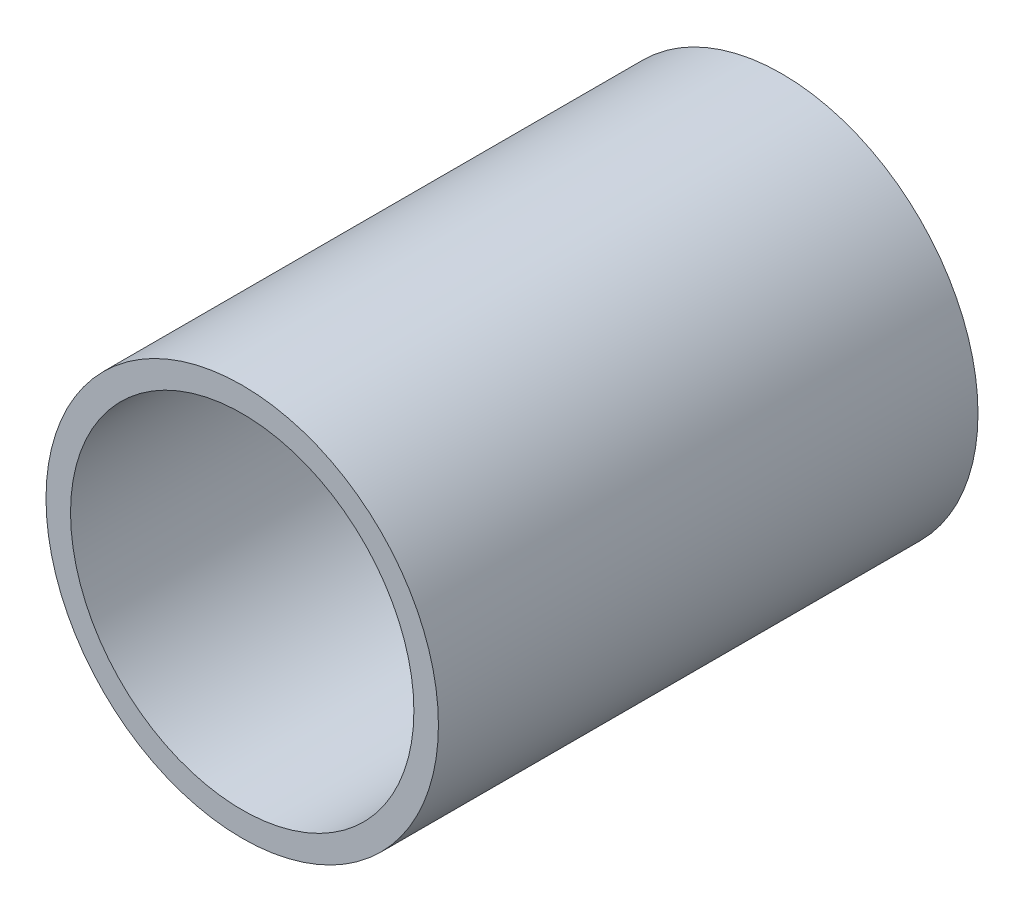
ISO-10303-21;
HEADER;
FILE_DESCRIPTION(('STEP AP214'),'2;1');
FILE_NAME('part.step','',(''),(''),'','','');
FILE_SCHEMA(('AUTOMOTIVE_DESIGN { 1 0 10303 214 1 1 1 1 }'));
ENDSEC;
DATA;
#1=APPLICATION_CONTEXT('core data for automotive mechanical design processes');
#2=APPLICATION_PROTOCOL_DEFINITION('international standard','automotive_design',2000,#1);
#3=PRODUCT_CONTEXT('',#1,'mechanical');
#4=PRODUCT('Part','Part','',(#3));
#5=PRODUCT_RELATED_PRODUCT_CATEGORY('part','',(#4));
#6=PRODUCT_DEFINITION_FORMATION('','',#4);
#7=PRODUCT_DEFINITION_CONTEXT('part definition',#1,'design');
#8=PRODUCT_DEFINITION('design','',#6,#7);
#9=PRODUCT_DEFINITION_SHAPE('','',#8);
#10=(LENGTH_UNIT() NAMED_UNIT(*) SI_UNIT(.MILLI.,.METRE.));
#11=(NAMED_UNIT(*) PLANE_ANGLE_UNIT() SI_UNIT($,.RADIAN.));
#12=(NAMED_UNIT(*) SI_UNIT($,.STERADIAN.) SOLID_ANGLE_UNIT());
#13=UNCERTAINTY_MEASURE_WITH_UNIT(LENGTH_MEASURE(1.E-05),#10,'distance_accuracy_value','');
#14=(GEOMETRIC_REPRESENTATION_CONTEXT(3) GLOBAL_UNCERTAINTY_ASSIGNED_CONTEXT((#13)) GLOBAL_UNIT_ASSIGNED_CONTEXT((#10,
#11,#12)) REPRESENTATION_CONTEXT('',''));
#15=CARTESIAN_POINT('',(0.,0.,0.));
#16=DIRECTION('',(0.,0.,1.));
#17=DIRECTION('',(1.,0.,0.));
#18=AXIS2_PLACEMENT_3D('',#15,#16,#17);
#19=CARTESIAN_POINT('',(0.,0.,110.));
#20=DIRECTION('',(0.,0.,-1.));
#21=DIRECTION('',(-1.,0.,0.));
#22=AXIS2_PLACEMENT_3D('',#19,#20,#21);
#23=CYLINDRICAL_SURFACE('',#22,40.);
#24=CARTESIAN_POINT('',(0.,0.,110.));
#25=DIRECTION('',(0.,0.,1.));
#26=DIRECTION('',(1.,0.,0.));
#27=AXIS2_PLACEMENT_3D('',#24,#25,#26);
#28=CIRCLE('',#27,40.);
#29=CARTESIAN_POINT('',(40.,0.,110.));
#30=VERTEX_POINT('',#29);
#31=EDGE_CURVE('E10',#30,#30,#28,.T.);
#32=ORIENTED_EDGE('',*,*,#31,.F.);
#33=EDGE_LOOP('',(#32));
#34=FACE_BOUND('',#33,.T.);
#35=CARTESIAN_POINT('',(0.,0.,0.));
#36=DIRECTION('',(0.,0.,1.));
#37=DIRECTION('',(1.,0.,0.));
#38=AXIS2_PLACEMENT_3D('',#35,#36,#37);
#39=CIRCLE('',#38,40.);
#40=CARTESIAN_POINT('',(40.,0.,0.));
#41=VERTEX_POINT('',#40);
#42=EDGE_CURVE('E40',#41,#41,#39,.T.);
#43=ORIENTED_EDGE('',*,*,#42,.T.);
#44=EDGE_LOOP('',(#43));
#45=FACE_BOUND('',#44,.T.);
#46=ADVANCED_FACE('F37',(#34,#45),#23,.T.);
#47=CARTESIAN_POINT('',(0.,0.,110.));
#48=DIRECTION('',(0.,0.,1.));
#49=DIRECTION('',(1.,0.,0.));
#50=AXIS2_PLACEMENT_3D('',#47,#48,#49);
#51=PLANE('',#50);
#52=CARTESIAN_POINT('',(0.,0.,110.));
#53=DIRECTION('',(0.,0.,1.));
#54=DIRECTION('',(1.,0.,0.));
#55=AXIS2_PLACEMENT_3D('',#52,#53,#54);
#56=CIRCLE('',#55,35.);
#57=CARTESIAN_POINT('',(35.,0.,110.));
#58=VERTEX_POINT('',#57);
#59=EDGE_CURVE('E51',#58,#58,#56,.T.);
#60=ORIENTED_EDGE('',*,*,#59,.F.);
#61=EDGE_LOOP('',(#60));
#62=FACE_BOUND('',#61,.T.);
#63=ORIENTED_EDGE('',*,*,#31,.T.);
#64=EDGE_LOOP('',(#63));
#65=FACE_BOUND('',#64,.T.);
#66=ADVANCED_FACE('F68',(#62,#65),#51,.T.);
#67=CARTESIAN_POINT('',(0.,0.,0.));
#68=DIRECTION('',(0.,0.,1.));
#69=DIRECTION('',(1.,0.,0.));
#70=AXIS2_PLACEMENT_3D('',#67,#68,#69);
#71=PLANE('',#70);
#72=CARTESIAN_POINT('',(0.,0.,0.));
#73=DIRECTION('',(0.,0.,1.));
#74=DIRECTION('',(1.,0.,0.));
#75=AXIS2_PLACEMENT_3D('',#72,#73,#74);
#76=CIRCLE('',#75,35.);
#77=CARTESIAN_POINT('',(35.,0.,0.));
#78=VERTEX_POINT('',#77);
#79=EDGE_CURVE('E49',#78,#78,#76,.T.);
#80=ORIENTED_EDGE('',*,*,#79,.T.);
#81=EDGE_LOOP('',(#80));
#82=FACE_BOUND('',#81,.T.);
#83=ORIENTED_EDGE('',*,*,#42,.F.);
#84=EDGE_LOOP('',(#83));
#85=FACE_BOUND('',#84,.T.);
#86=ADVANCED_FACE('F59',(#82,#85),#71,.F.);
#87=CARTESIAN_POINT('',(0.,0.,0.));
#88=DIRECTION('',(0.,0.,1.));
#89=DIRECTION('',(1.,0.,0.));
#90=AXIS2_PLACEMENT_3D('',#87,#88,#89);
#91=CYLINDRICAL_SURFACE('',#90,35.);
#92=ORIENTED_EDGE('',*,*,#79,.F.);
#93=EDGE_LOOP('',(#92));
#94=FACE_BOUND('',#93,.T.);
#95=ORIENTED_EDGE('',*,*,#59,.T.);
#96=EDGE_LOOP('',(#95));
#97=FACE_BOUND('',#96,.T.);
#98=ADVANCED_FACE('F62',(#94,#97),#91,.F.);
#99=CLOSED_SHELL('',(#46,#66,#86,#98));
#100=MANIFOLD_SOLID_BREP('B2',#99);
#101=ADVANCED_BREP_SHAPE_REPRESENTATION('',(#18,#100),#14);
#102=SHAPE_DEFINITION_REPRESENTATION(#9,#101);
ENDSEC;
END-ISO-10303-21;
